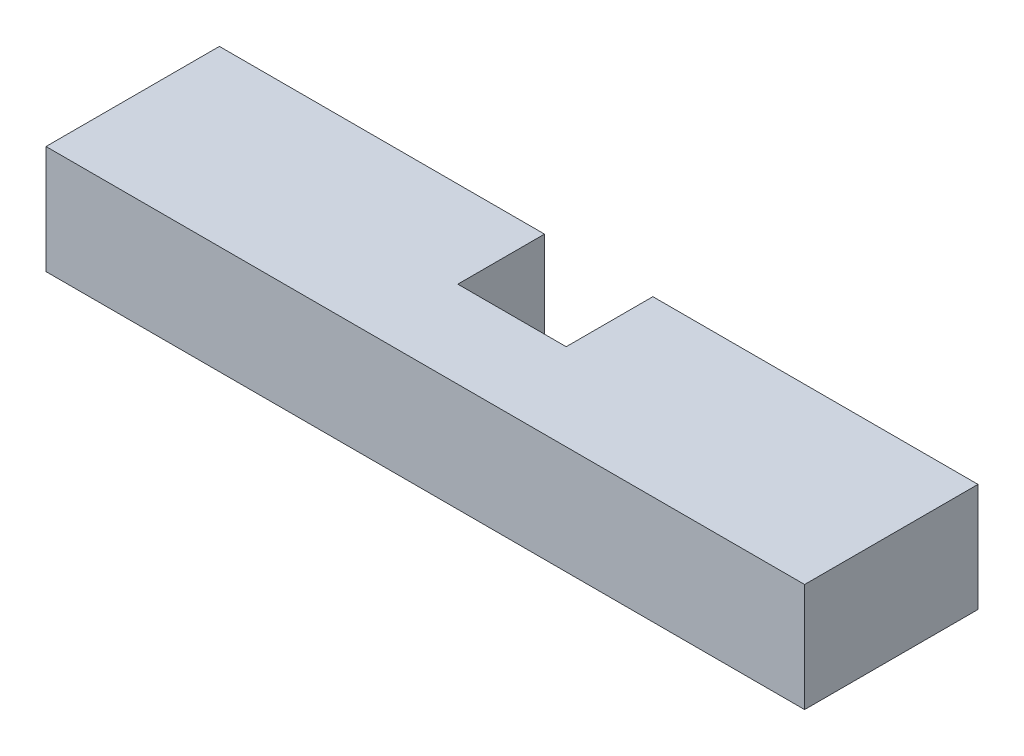
ISO-10303-21;
HEADER;
FILE_DESCRIPTION(('STEP AP214'),'2;1');
FILE_NAME('part.step','',(''),(''),'','','');
FILE_SCHEMA(('AUTOMOTIVE_DESIGN { 1 0 10303 214 1 1 1 1 }'));
ENDSEC;
DATA;
#1=APPLICATION_CONTEXT('core data for automotive mechanical design processes');
#2=APPLICATION_PROTOCOL_DEFINITION('international standard','automotive_design',2000,#1);
#3=PRODUCT_CONTEXT('',#1,'mechanical');
#4=PRODUCT('Part','Part','',(#3));
#5=PRODUCT_RELATED_PRODUCT_CATEGORY('part','',(#4));
#6=PRODUCT_DEFINITION_FORMATION('','',#4);
#7=PRODUCT_DEFINITION_CONTEXT('part definition',#1,'design');
#8=PRODUCT_DEFINITION('design','',#6,#7);
#9=PRODUCT_DEFINITION_SHAPE('','',#8);
#10=(LENGTH_UNIT() NAMED_UNIT(*) SI_UNIT(.MILLI.,.METRE.));
#11=(NAMED_UNIT(*) PLANE_ANGLE_UNIT() SI_UNIT($,.RADIAN.));
#12=(NAMED_UNIT(*) SI_UNIT($,.STERADIAN.) SOLID_ANGLE_UNIT());
#13=UNCERTAINTY_MEASURE_WITH_UNIT(LENGTH_MEASURE(1.E-05),#10,'distance_accuracy_value','');
#14=(GEOMETRIC_REPRESENTATION_CONTEXT(3) GLOBAL_UNCERTAINTY_ASSIGNED_CONTEXT((#13)) GLOBAL_UNIT_ASSIGNED_CONTEXT((#10,
#11,#12)) REPRESENTATION_CONTEXT('',''));
#15=CARTESIAN_POINT('',(0.,0.,0.));
#16=DIRECTION('',(0.,0.,1.));
#17=DIRECTION('',(1.,0.,0.));
#18=AXIS2_PLACEMENT_3D('',#15,#16,#17);
#19=CARTESIAN_POINT('',(0.,6.35,-5.08));
#20=DIRECTION('',(0.,0.,-1.));
#21=DIRECTION('',(-1.,0.,0.));
#22=AXIS2_PLACEMENT_3D('',#19,#20,#21);
#23=PLANE('',#22);
#24=DIRECTION('',(1.,0.,0.));
#25=VECTOR('',#24,1.);
#26=CARTESIAN_POINT('',(0.,0.,-5.08));
#27=LINE('',#26,#25);
#28=CARTESIAN_POINT('',(3.175,0.,-5.08));
#29=VERTEX_POINT('',#28);
#30=CARTESIAN_POINT('',(22.225,0.,-5.08));
#31=VERTEX_POINT('',#30);
#32=EDGE_CURVE('E128',#29,#31,#27,.T.);
#33=ORIENTED_EDGE('',*,*,#32,.F.);
#34=DIRECTION('',(0.,-1.,0.));
#35=VECTOR('',#34,1.);
#36=CARTESIAN_POINT('',(3.175,6.35,-5.08));
#37=LINE('',#36,#35);
#38=CARTESIAN_POINT('',(3.175,6.35,-5.08));
#39=VERTEX_POINT('',#38);
#40=EDGE_CURVE('E11',#39,#29,#37,.T.);
#41=ORIENTED_EDGE('',*,*,#40,.F.);
#42=DIRECTION('',(1.,0.,0.));
#43=VECTOR('',#42,1.);
#44=CARTESIAN_POINT('',(0.,6.35,-5.08));
#45=LINE('',#44,#43);
#46=CARTESIAN_POINT('',(22.225,6.35,-5.08));
#47=VERTEX_POINT('',#46);
#48=EDGE_CURVE('E147',#39,#47,#45,.T.);
#49=ORIENTED_EDGE('',*,*,#48,.T.);
#50=DIRECTION('',(0.,-1.,0.));
#51=VECTOR('',#50,1.);
#52=CARTESIAN_POINT('',(22.225,6.35,-5.08));
#53=LINE('',#52,#51);
#54=EDGE_CURVE('E85',#47,#31,#53,.T.);
#55=ORIENTED_EDGE('',*,*,#54,.T.);
#56=EDGE_LOOP('',(#33,#41,#49,#55));
#57=FACE_BOUND('',#56,.T.);
#58=ADVANCED_FACE('F35',(#57),#23,.T.);
#59=CARTESIAN_POINT('',(3.175,6.35,0.));
#60=DIRECTION('',(-1.,0.,0.));
#61=DIRECTION('',(0.,0.,1.));
#62=AXIS2_PLACEMENT_3D('',#59,#60,#61);
#63=PLANE('',#62);
#64=DIRECTION('',(0.,0.,-1.));
#65=VECTOR('',#64,1.);
#66=CARTESIAN_POINT('',(3.175,0.,0.));
#67=LINE('',#66,#65);
#68=CARTESIAN_POINT('',(3.175,0.,0.));
#69=VERTEX_POINT('',#68);
#70=EDGE_CURVE('E131',#69,#29,#67,.T.);
#71=ORIENTED_EDGE('',*,*,#70,.F.);
#72=DIRECTION('',(0.,-1.,0.));
#73=VECTOR('',#72,1.);
#74=CARTESIAN_POINT('',(3.175,6.35,0.));
#75=LINE('',#74,#73);
#76=CARTESIAN_POINT('',(3.175,6.35,0.));
#77=VERTEX_POINT('',#76);
#78=EDGE_CURVE('E43',#77,#69,#75,.T.);
#79=ORIENTED_EDGE('',*,*,#78,.F.);
#80=DIRECTION('',(0.,0.,-1.));
#81=VECTOR('',#80,1.);
#82=CARTESIAN_POINT('',(3.175,6.35,0.));
#83=LINE('',#82,#81);
#84=EDGE_CURVE('E173',#77,#39,#83,.T.);
#85=ORIENTED_EDGE('',*,*,#84,.T.);
#86=ORIENTED_EDGE('',*,*,#40,.T.);
#87=EDGE_LOOP('',(#71,#79,#85,#86));
#88=FACE_BOUND('',#87,.T.);
#89=ADVANCED_FACE('F164',(#88),#63,.T.);
#90=CARTESIAN_POINT('',(0.,6.35,0.));
#91=DIRECTION('',(0.,0.,-1.));
#92=DIRECTION('',(-1.,0.,0.));
#93=AXIS2_PLACEMENT_3D('',#90,#91,#92);
#94=PLANE('',#93);
#95=DIRECTION('',(1.,0.,0.));
#96=VECTOR('',#95,1.);
#97=CARTESIAN_POINT('',(0.,0.,0.));
#98=LINE('',#97,#96);
#99=CARTESIAN_POINT('',(-3.175,0.,0.));
#100=VERTEX_POINT('',#99);
#101=EDGE_CURVE('E134',#100,#69,#98,.T.);
#102=ORIENTED_EDGE('',*,*,#101,.F.);
#103=DIRECTION('',(0.,-1.,0.));
#104=VECTOR('',#103,1.);
#105=CARTESIAN_POINT('',(-3.175,6.35,0.));
#106=LINE('',#105,#104);
#107=CARTESIAN_POINT('',(-3.175,6.35,0.));
#108=VERTEX_POINT('',#107);
#109=EDGE_CURVE('E153',#108,#100,#106,.T.);
#110=ORIENTED_EDGE('',*,*,#109,.F.);
#111=DIRECTION('',(1.,0.,0.));
#112=VECTOR('',#111,1.);
#113=CARTESIAN_POINT('',(0.,6.35,0.));
#114=LINE('',#113,#112);
#115=EDGE_CURVE('E160',#108,#77,#114,.T.);
#116=ORIENTED_EDGE('',*,*,#115,.T.);
#117=ORIENTED_EDGE('',*,*,#78,.T.);
#118=EDGE_LOOP('',(#102,#110,#116,#117));
#119=FACE_BOUND('',#118,.T.);
#120=ADVANCED_FACE('F158',(#119),#94,.T.);
#121=CARTESIAN_POINT('',(-3.175,6.35,0.));
#122=DIRECTION('',(-1.,0.,0.));
#123=DIRECTION('',(0.,0.,1.));
#124=AXIS2_PLACEMENT_3D('',#121,#122,#123);
#125=PLANE('',#124);
#126=DIRECTION('',(0.,0.,-1.));
#127=VECTOR('',#126,1.);
#128=CARTESIAN_POINT('',(-3.175,0.,0.));
#129=LINE('',#128,#127);
#130=CARTESIAN_POINT('',(-3.175,0.,-5.08));
#131=VERTEX_POINT('',#130);
#132=EDGE_CURVE('E137',#100,#131,#129,.T.);
#133=ORIENTED_EDGE('',*,*,#132,.T.);
#134=DIRECTION('',(0.,-1.,0.));
#135=VECTOR('',#134,1.);
#136=CARTESIAN_POINT('',(-3.175,6.35,-5.08));
#137=LINE('',#136,#135);
#138=CARTESIAN_POINT('',(-3.175,6.35,-5.08));
#139=VERTEX_POINT('',#138);
#140=EDGE_CURVE('E151',#139,#131,#137,.T.);
#141=ORIENTED_EDGE('',*,*,#140,.F.);
#142=DIRECTION('',(0.,0.,-1.));
#143=VECTOR('',#142,1.);
#144=CARTESIAN_POINT('',(-3.175,6.35,0.));
#145=LINE('',#144,#143);
#146=EDGE_CURVE('E123',#108,#139,#145,.T.);
#147=ORIENTED_EDGE('',*,*,#146,.F.);
#148=ORIENTED_EDGE('',*,*,#109,.T.);
#149=EDGE_LOOP('',(#133,#141,#147,#148));
#150=FACE_BOUND('',#149,.T.);
#151=ADVANCED_FACE('F171',(#150),#125,.F.);
#152=CARTESIAN_POINT('',(0.,6.35,-5.08));
#153=DIRECTION('',(0.,0.,-1.));
#154=DIRECTION('',(-1.,0.,0.));
#155=AXIS2_PLACEMENT_3D('',#152,#153,#154);
#156=PLANE('',#155);
#157=DIRECTION('',(1.,0.,0.));
#158=VECTOR('',#157,1.);
#159=CARTESIAN_POINT('',(0.,0.,-5.08));
#160=LINE('',#159,#158);
#161=CARTESIAN_POINT('',(-22.225,0.,-5.08));
#162=VERTEX_POINT('',#161);
#163=EDGE_CURVE('E140',#162,#131,#160,.T.);
#164=ORIENTED_EDGE('',*,*,#163,.F.);
#165=DIRECTION('',(0.,-1.,0.));
#166=VECTOR('',#165,1.);
#167=CARTESIAN_POINT('',(-22.225,6.35,-5.08));
#168=LINE('',#167,#166);
#169=CARTESIAN_POINT('',(-22.225,6.35,-5.08));
#170=VERTEX_POINT('',#169);
#171=EDGE_CURVE('E112',#170,#162,#168,.T.);
#172=ORIENTED_EDGE('',*,*,#171,.F.);
#173=DIRECTION('',(1.,0.,0.));
#174=VECTOR('',#173,1.);
#175=CARTESIAN_POINT('',(0.,6.35,-5.08));
#176=LINE('',#175,#174);
#177=EDGE_CURVE('E121',#170,#139,#176,.T.);
#178=ORIENTED_EDGE('',*,*,#177,.T.);
#179=ORIENTED_EDGE('',*,*,#140,.T.);
#180=EDGE_LOOP('',(#164,#172,#178,#179));
#181=FACE_BOUND('',#180,.T.);
#182=ADVANCED_FACE('F188',(#181),#156,.T.);
#183=CARTESIAN_POINT('',(-22.225,6.35,0.));
#184=DIRECTION('',(-1.,0.,0.));
#185=DIRECTION('',(0.,0.,1.));
#186=AXIS2_PLACEMENT_3D('',#183,#184,#185);
#187=PLANE('',#186);
#188=DIRECTION('',(0.,0.,-1.));
#189=VECTOR('',#188,1.);
#190=CARTESIAN_POINT('',(-22.225,0.,0.));
#191=LINE('',#190,#189);
#192=CARTESIAN_POINT('',(-22.225,0.,5.08));
#193=VERTEX_POINT('',#192);
#194=EDGE_CURVE('E111',#193,#162,#191,.T.);
#195=ORIENTED_EDGE('',*,*,#194,.F.);
#196=DIRECTION('',(0.,-1.,0.));
#197=VECTOR('',#196,1.);
#198=CARTESIAN_POINT('',(-22.225,6.35,5.08));
#199=LINE('',#198,#197);
#200=CARTESIAN_POINT('',(-22.225,6.35,5.08));
#201=VERTEX_POINT('',#200);
#202=EDGE_CURVE('E105',#201,#193,#199,.T.);
#203=ORIENTED_EDGE('',*,*,#202,.F.);
#204=DIRECTION('',(0.,0.,-1.));
#205=VECTOR('',#204,1.);
#206=CARTESIAN_POINT('',(-22.225,6.35,0.));
#207=LINE('',#206,#205);
#208=EDGE_CURVE('E109',#201,#170,#207,.T.);
#209=ORIENTED_EDGE('',*,*,#208,.T.);
#210=ORIENTED_EDGE('',*,*,#171,.T.);
#211=EDGE_LOOP('',(#195,#203,#209,#210));
#212=FACE_BOUND('',#211,.T.);
#213=ADVANCED_FACE('F107',(#212),#187,.T.);
#214=CARTESIAN_POINT('',(0.,6.35,5.08));
#215=DIRECTION('',(0.,0.,-1.));
#216=DIRECTION('',(-1.,0.,0.));
#217=AXIS2_PLACEMENT_3D('',#214,#215,#216);
#218=PLANE('',#217);
#219=DIRECTION('',(1.,0.,0.));
#220=VECTOR('',#219,1.);
#221=CARTESIAN_POINT('',(0.,0.,5.08));
#222=LINE('',#221,#220);
#223=CARTESIAN_POINT('',(22.225,0.,5.08));
#224=VERTEX_POINT('',#223);
#225=EDGE_CURVE('E78',#193,#224,#222,.T.);
#226=ORIENTED_EDGE('',*,*,#225,.T.);
#227=DIRECTION('',(0.,-1.,0.));
#228=VECTOR('',#227,1.);
#229=CARTESIAN_POINT('',(22.225,6.35,5.08));
#230=LINE('',#229,#228);
#231=CARTESIAN_POINT('',(22.225,6.35,5.08));
#232=VERTEX_POINT('',#231);
#233=EDGE_CURVE('E113',#232,#224,#230,.T.);
#234=ORIENTED_EDGE('',*,*,#233,.F.);
#235=DIRECTION('',(1.,0.,0.));
#236=VECTOR('',#235,1.);
#237=CARTESIAN_POINT('',(0.,6.35,5.08));
#238=LINE('',#237,#236);
#239=EDGE_CURVE('E115',#201,#232,#238,.T.);
#240=ORIENTED_EDGE('',*,*,#239,.F.);
#241=ORIENTED_EDGE('',*,*,#202,.T.);
#242=EDGE_LOOP('',(#226,#234,#240,#241));
#243=FACE_BOUND('',#242,.T.);
#244=ADVANCED_FACE('F116',(#243),#218,.F.);
#245=CARTESIAN_POINT('',(22.225,6.35,0.));
#246=DIRECTION('',(-1.,0.,0.));
#247=DIRECTION('',(0.,0.,1.));
#248=AXIS2_PLACEMENT_3D('',#245,#246,#247);
#249=PLANE('',#248);
#250=DIRECTION('',(0.,0.,-1.));
#251=VECTOR('',#250,1.);
#252=CARTESIAN_POINT('',(22.225,0.,0.));
#253=LINE('',#252,#251);
#254=EDGE_CURVE('E145',#224,#31,#253,.T.);
#255=ORIENTED_EDGE('',*,*,#254,.T.);
#256=ORIENTED_EDGE('',*,*,#54,.F.);
#257=DIRECTION('',(0.,0.,-1.));
#258=VECTOR('',#257,1.);
#259=CARTESIAN_POINT('',(22.225,6.35,0.));
#260=LINE('',#259,#258);
#261=EDGE_CURVE('E51',#232,#47,#260,.T.);
#262=ORIENTED_EDGE('',*,*,#261,.F.);
#263=ORIENTED_EDGE('',*,*,#233,.T.);
#264=EDGE_LOOP('',(#255,#256,#262,#263));
#265=FACE_BOUND('',#264,.T.);
#266=ADVANCED_FACE('F196',(#265),#249,.F.);
#267=CARTESIAN_POINT('',(0.,6.35,0.));
#268=DIRECTION('',(0.,1.,0.));
#269=DIRECTION('',(0.,0.,1.));
#270=AXIS2_PLACEMENT_3D('',#267,#268,#269);
#271=PLANE('',#270);
#272=ORIENTED_EDGE('',*,*,#48,.F.);
#273=ORIENTED_EDGE('',*,*,#84,.F.);
#274=ORIENTED_EDGE('',*,*,#115,.F.);
#275=ORIENTED_EDGE('',*,*,#146,.T.);
#276=ORIENTED_EDGE('',*,*,#177,.F.);
#277=ORIENTED_EDGE('',*,*,#208,.F.);
#278=ORIENTED_EDGE('',*,*,#239,.T.);
#279=ORIENTED_EDGE('',*,*,#261,.T.);
#280=EDGE_LOOP('',(#272,#273,#274,#275,#276,#277,#278,#279));
#281=FACE_BOUND('',#280,.T.);
#282=ADVANCED_FACE('F119',(#281),#271,.T.);
#283=CARTESIAN_POINT('',(0.,0.,0.));
#284=DIRECTION('',(0.,1.,0.));
#285=DIRECTION('',(0.,0.,1.));
#286=AXIS2_PLACEMENT_3D('',#283,#284,#285);
#287=PLANE('',#286);
#288=ORIENTED_EDGE('',*,*,#32,.T.);
#289=ORIENTED_EDGE('',*,*,#254,.F.);
#290=ORIENTED_EDGE('',*,*,#225,.F.);
#291=ORIENTED_EDGE('',*,*,#194,.T.);
#292=ORIENTED_EDGE('',*,*,#163,.T.);
#293=ORIENTED_EDGE('',*,*,#132,.F.);
#294=ORIENTED_EDGE('',*,*,#101,.T.);
#295=ORIENTED_EDGE('',*,*,#70,.T.);
#296=EDGE_LOOP('',(#288,#289,#290,#291,#292,#293,#294,#295));
#297=FACE_BOUND('',#296,.T.);
#298=ADVANCED_FACE('F167',(#297),#287,.F.);
#299=CLOSED_SHELL('',(#58,#89,#120,#151,#182,#213,#244,#266,#282,#298));
#300=MANIFOLD_SOLID_BREP('B2',#299);
#301=ADVANCED_BREP_SHAPE_REPRESENTATION('',(#18,#300),#14);
#302=SHAPE_DEFINITION_REPRESENTATION(#9,#301);
ENDSEC;
END-ISO-10303-21;
